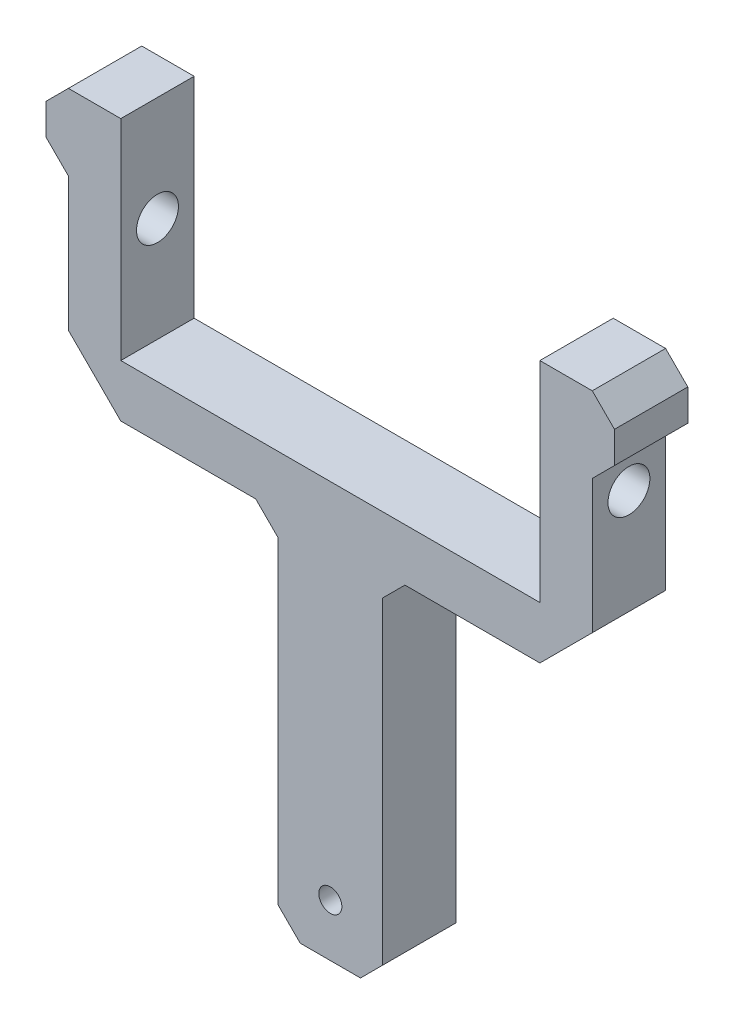
ISO-10303-21;
HEADER;
FILE_DESCRIPTION(('STEP AP214'),'2;1');
FILE_NAME('part.step','',(''),(''),'','','');
FILE_SCHEMA(('AUTOMOTIVE_DESIGN { 1 0 10303 214 1 1 1 1 }'));
ENDSEC;
DATA;
#1=APPLICATION_CONTEXT('core data for automotive mechanical design processes');
#2=APPLICATION_PROTOCOL_DEFINITION('international standard','automotive_design',2000,#1);
#3=PRODUCT_CONTEXT('',#1,'mechanical');
#4=PRODUCT('Part','Part','',(#3));
#5=PRODUCT_RELATED_PRODUCT_CATEGORY('part','',(#4));
#6=PRODUCT_DEFINITION_FORMATION('','',#4);
#7=PRODUCT_DEFINITION_CONTEXT('part definition',#1,'design');
#8=PRODUCT_DEFINITION('design','',#6,#7);
#9=PRODUCT_DEFINITION_SHAPE('','',#8);
#10=(LENGTH_UNIT() NAMED_UNIT(*) SI_UNIT(.MILLI.,.METRE.));
#11=(NAMED_UNIT(*) PLANE_ANGLE_UNIT() SI_UNIT($,.RADIAN.));
#12=(NAMED_UNIT(*) SI_UNIT($,.STERADIAN.) SOLID_ANGLE_UNIT());
#13=UNCERTAINTY_MEASURE_WITH_UNIT(LENGTH_MEASURE(1.E-05),#10,'distance_accuracy_value','');
#14=(GEOMETRIC_REPRESENTATION_CONTEXT(3) GLOBAL_UNCERTAINTY_ASSIGNED_CONTEXT((#13)) GLOBAL_UNIT_ASSIGNED_CONTEXT((#10,
#11,#12)) REPRESENTATION_CONTEXT('',''));
#15=CARTESIAN_POINT('',(0.,0.,0.));
#16=DIRECTION('',(0.,0.,1.));
#17=DIRECTION('',(1.,0.,0.));
#18=AXIS2_PLACEMENT_3D('',#15,#16,#17);
#19=CARTESIAN_POINT('',(-11.1786796564404,11.1786796564405,7.));
#20=DIRECTION('',(0.707106781186545,-0.70710678118655,0.));
#21=DIRECTION('',(0.70710678118655,0.707106781186545,0.));
#22=AXIS2_PLACEMENT_3D('',#19,#20,#21);
#23=PLANE('',#22);
#24=DIRECTION('',(0.,0.,-1.));
#25=VECTOR('',#24,1.);
#26=CARTESIAN_POINT('',(25.,47.3573593128807,7.));
#27=LINE('',#26,#25);
#28=CARTESIAN_POINT('',(25.,47.3573593128807,7.));
#29=VERTEX_POINT('',#28);
#30=CARTESIAN_POINT('',(25.,47.3573593128807,6.0386807597648));
#31=VERTEX_POINT('',#30);
#32=EDGE_CURVE('E224',#29,#31,#27,.T.);
#33=ORIENTED_EDGE('',*,*,#32,.T.);
#34=CARTESIAN_POINT('',(22.24,44.5973593128807,3.5));
#35=DIRECTION('',(0.707106781186545,-0.70710678118655,0.));
#36=DIRECTION('',(-0.70710678118655,-0.707106781186545,0.));
#37=AXIS2_PLACEMENT_3D('',#34,#35,#36);
#38=ELLIPSE('',#37,5.30330085889913,3.75);
#39=CARTESIAN_POINT('',(25.,47.3573593128807,0.961319240235201));
#40=VERTEX_POINT('',#39);
#41=EDGE_CURVE('E215',#31,#40,#38,.F.);
#42=ORIENTED_EDGE('',*,*,#41,.T.);
#43=CARTESIAN_POINT('',(25.,47.3573593128807,0.));
#44=VERTEX_POINT('',#43);
#45=EDGE_CURVE('E221',#40,#44,#27,.T.);
#46=ORIENTED_EDGE('',*,*,#45,.T.);
#47=DIRECTION('',(-0.70710678118655,-0.707106781186545,0.));
#48=VECTOR('',#47,1.);
#49=CARTESIAN_POINT('',(-11.1786796564404,11.1786796564405,0.));
#50=LINE('',#49,#48);
#51=CARTESIAN_POINT('',(27.1213203435596,49.4786796564403,0.));
#52=VERTEX_POINT('',#51);
#53=EDGE_CURVE('E279',#52,#44,#50,.T.);
#54=ORIENTED_EDGE('',*,*,#53,.F.);
#55=DIRECTION('',(0.,0.,-1.));
#56=VECTOR('',#55,1.);
#57=CARTESIAN_POINT('',(27.1213203435596,49.4786796564403,7.));
#58=LINE('',#57,#56);
#59=CARTESIAN_POINT('',(27.1213203435596,49.4786796564403,7.));
#60=VERTEX_POINT('',#59);
#61=EDGE_CURVE('E233',#60,#52,#58,.T.);
#62=ORIENTED_EDGE('',*,*,#61,.F.);
#63=DIRECTION('',(-0.70710678118655,-0.707106781186545,0.));
#64=VECTOR('',#63,1.);
#65=CARTESIAN_POINT('',(-11.1786796564404,11.1786796564405,7.));
#66=LINE('',#65,#64);
#67=EDGE_CURVE('E416',#60,#29,#66,.T.);
#68=ORIENTED_EDGE('',*,*,#67,.T.);
#69=EDGE_LOOP('',(#33,#42,#46,#54,#62,#68));
#70=FACE_BOUND('',#69,.T.);
#71=ADVANCED_FACE('F41',(#70),#23,.T.);
#72=CARTESIAN_POINT('',(11.1786796564404,11.1786796564405,7.));
#73=DIRECTION('',(0.707106781186545,0.70710678118655,0.));
#74=DIRECTION('',(-0.70710678118655,0.707106781186545,0.));
#75=AXIS2_PLACEMENT_3D('',#72,#73,#74);
#76=PLANE('',#75);
#77=CARTESIAN_POINT('',(-22.24,44.5973593128807,3.5));
#78=DIRECTION('',(0.707106781186545,0.70710678118655,0.));
#79=DIRECTION('',(0.70710678118655,-0.707106781186545,0.));
#80=AXIS2_PLACEMENT_3D('',#77,#78,#79);
#81=ELLIPSE('',#80,5.30330085889913,3.75);
#82=CARTESIAN_POINT('',(-25.,47.3573593128807,6.03868075976481));
#83=VERTEX_POINT('',#82);
#84=CARTESIAN_POINT('',(-25.,47.3573593128807,0.961319240235193));
#85=VERTEX_POINT('',#84);
#86=EDGE_CURVE('E872',#83,#85,#81,.F.);
#87=ORIENTED_EDGE('',*,*,#86,.F.);
#88=DIRECTION('',(0.,0.,-1.));
#89=VECTOR('',#88,1.);
#90=CARTESIAN_POINT('',(-25.,47.3573593128807,7.));
#91=LINE('',#90,#89);
#92=CARTESIAN_POINT('',(-25.,47.3573593128807,7.));
#93=VERTEX_POINT('',#92);
#94=EDGE_CURVE('E355',#93,#83,#91,.T.);
#95=ORIENTED_EDGE('',*,*,#94,.F.);
#96=DIRECTION('',(0.70710678118655,-0.707106781186545,0.));
#97=VECTOR('',#96,1.);
#98=CARTESIAN_POINT('',(11.1786796564404,11.1786796564405,7.));
#99=LINE('',#98,#97);
#100=CARTESIAN_POINT('',(-27.1213203435596,49.4786796564403,7.));
#101=VERTEX_POINT('',#100);
#102=EDGE_CURVE('E439',#101,#93,#99,.T.);
#103=ORIENTED_EDGE('',*,*,#102,.F.);
#104=DIRECTION('',(0.,0.,-1.));
#105=VECTOR('',#104,1.);
#106=CARTESIAN_POINT('',(-27.1213203435596,49.4786796564403,7.));
#107=LINE('',#106,#105);
#108=CARTESIAN_POINT('',(-27.1213203435596,49.4786796564403,0.));
#109=VERTEX_POINT('',#108);
#110=EDGE_CURVE('E358',#101,#109,#107,.T.);
#111=ORIENTED_EDGE('',*,*,#110,.T.);
#112=DIRECTION('',(0.70710678118655,-0.707106781186545,0.));
#113=VECTOR('',#112,1.);
#114=CARTESIAN_POINT('',(11.1786796564404,11.1786796564405,0.));
#115=LINE('',#114,#113);
#116=CARTESIAN_POINT('',(-25.,47.3573593128807,0.));
#117=VERTEX_POINT('',#116);
#118=EDGE_CURVE('E315',#109,#117,#115,.T.);
#119=ORIENTED_EDGE('',*,*,#118,.T.);
#120=EDGE_CURVE('E354',#85,#117,#91,.T.);
#121=ORIENTED_EDGE('',*,*,#120,.F.);
#122=EDGE_LOOP('',(#87,#95,#103,#111,#119,#121));
#123=FACE_BOUND('',#122,.T.);
#124=ADVANCED_FACE('F506',(#123),#76,.F.);
#125=CARTESIAN_POINT('',(-5.,0.,7.));
#126=DIRECTION('',(-1.,0.,0.));
#127=DIRECTION('',(0.,0.,1.));
#128=AXIS2_PLACEMENT_3D('',#125,#126,#127);
#129=PLANE('',#128);
#130=DIRECTION('',(0.,0.,-1.));
#131=VECTOR('',#130,1.);
#132=CARTESIAN_POINT('',(-5.,-2.87867965644036,7.));
#133=LINE('',#132,#131);
#134=CARTESIAN_POINT('',(-5.,-2.87867965644036,7.));
#135=VERTEX_POINT('',#134);
#136=CARTESIAN_POINT('',(-5.,-2.87867965644036,0.));
#137=VERTEX_POINT('',#136);
#138=EDGE_CURVE('E817',#135,#137,#133,.T.);
#139=ORIENTED_EDGE('',*,*,#138,.F.);
#140=DIRECTION('',(0.,1.,0.));
#141=VECTOR('',#140,1.);
#142=CARTESIAN_POINT('',(-5.,0.,7.));
#143=LINE('',#142,#141);
#144=CARTESIAN_POINT('',(-5.,27.4786796564403,7.));
#145=VERTEX_POINT('',#144);
#146=EDGE_CURVE('E338',#135,#145,#143,.T.);
#147=ORIENTED_EDGE('',*,*,#146,.T.);
#148=DIRECTION('',(0.,0.,-1.));
#149=VECTOR('',#148,1.);
#150=CARTESIAN_POINT('',(-5.,27.4786796564403,7.));
#151=LINE('',#150,#149);
#152=CARTESIAN_POINT('',(-5.,27.4786796564403,0.));
#153=VERTEX_POINT('',#152);
#154=EDGE_CURVE('E339',#145,#153,#151,.T.);
#155=ORIENTED_EDGE('',*,*,#154,.T.);
#156=DIRECTION('',(0.,1.,0.));
#157=VECTOR('',#156,1.);
#158=CARTESIAN_POINT('',(-5.,0.,0.));
#159=LINE('',#158,#157);
#160=EDGE_CURVE('E459',#137,#153,#159,.T.);
#161=ORIENTED_EDGE('',*,*,#160,.F.);
#162=EDGE_LOOP('',(#139,#147,#155,#161));
#163=FACE_BOUND('',#162,.T.);
#164=ADVANCED_FACE('F43',(#163),#129,.T.);
#165=CARTESIAN_POINT('',(0.,-5.,7.));
#166=DIRECTION('',(0.,1.,0.));
#167=DIRECTION('',(0.,0.,1.));
#168=AXIS2_PLACEMENT_3D('',#165,#166,#167);
#169=PLANE('',#168);
#170=DIRECTION('',(1.,0.,0.));
#171=VECTOR('',#170,1.);
#172=CARTESIAN_POINT('',(0.,-5.,0.));
#173=LINE('',#172,#171);
#174=CARTESIAN_POINT('',(-2.87867965644035,-4.99999999999999,0.));
#175=VERTEX_POINT('',#174);
#176=CARTESIAN_POINT('',(2.87867965644035,-5.,0.));
#177=VERTEX_POINT('',#176);
#178=EDGE_CURVE('E462',#175,#177,#173,.T.);
#179=ORIENTED_EDGE('',*,*,#178,.T.);
#180=DIRECTION('',(0.,0.,-1.));
#181=VECTOR('',#180,1.);
#182=CARTESIAN_POINT('',(2.87867965644035,-5.,7.));
#183=LINE('',#182,#181);
#184=CARTESIAN_POINT('',(2.87867965644035,-5.,7.));
#185=VERTEX_POINT('',#184);
#186=EDGE_CURVE('E804',#185,#177,#183,.T.);
#187=ORIENTED_EDGE('',*,*,#186,.F.);
#188=DIRECTION('',(1.,0.,0.));
#189=VECTOR('',#188,1.);
#190=CARTESIAN_POINT('',(0.,-5.,7.));
#191=LINE('',#190,#189);
#192=CARTESIAN_POINT('',(-2.87867965644035,-4.99999999999999,7.));
#193=VERTEX_POINT('',#192);
#194=EDGE_CURVE('E482',#193,#185,#191,.T.);
#195=ORIENTED_EDGE('',*,*,#194,.F.);
#196=DIRECTION('',(0.,0.,-1.));
#197=VECTOR('',#196,1.);
#198=CARTESIAN_POINT('',(-2.87867965644035,-4.99999999999999,7.));
#199=LINE('',#198,#197);
#200=EDGE_CURVE('E806',#193,#175,#199,.T.);
#201=ORIENTED_EDGE('',*,*,#200,.T.);
#202=EDGE_LOOP('',(#179,#187,#195,#201));
#203=FACE_BOUND('',#202,.T.);
#204=ADVANCED_FACE('F736',(#203),#169,.F.);
#205=CARTESIAN_POINT('',(5.,0.,7.));
#206=DIRECTION('',(-1.,0.,0.));
#207=DIRECTION('',(0.,0.,1.));
#208=AXIS2_PLACEMENT_3D('',#205,#206,#207);
#209=PLANE('',#208);
#210=DIRECTION('',(0.,1.,0.));
#211=VECTOR('',#210,1.);
#212=CARTESIAN_POINT('',(5.,0.,7.));
#213=LINE('',#212,#211);
#214=CARTESIAN_POINT('',(5.,-2.87867965644037,7.));
#215=VERTEX_POINT('',#214);
#216=CARTESIAN_POINT('',(5.,27.4786796564403,7.));
#217=VERTEX_POINT('',#216);
#218=EDGE_CURVE('E476',#215,#217,#213,.T.);
#219=ORIENTED_EDGE('',*,*,#218,.F.);
#220=DIRECTION('',(0.,0.,-1.));
#221=VECTOR('',#220,1.);
#222=CARTESIAN_POINT('',(5.,-2.87867965644037,7.));
#223=LINE('',#222,#221);
#224=CARTESIAN_POINT('',(5.,-2.87867965644037,0.));
#225=VERTEX_POINT('',#224);
#226=EDGE_CURVE('E463',#215,#225,#223,.T.);
#227=ORIENTED_EDGE('',*,*,#226,.T.);
#228=DIRECTION('',(0.,1.,0.));
#229=VECTOR('',#228,1.);
#230=CARTESIAN_POINT('',(5.,0.,0.));
#231=LINE('',#230,#229);
#232=CARTESIAN_POINT('',(5.,27.4786796564403,0.));
#233=VERTEX_POINT('',#232);
#234=EDGE_CURVE('E273',#225,#233,#231,.T.);
#235=ORIENTED_EDGE('',*,*,#234,.T.);
#236=DIRECTION('',(0.,0.,-1.));
#237=VECTOR('',#236,1.);
#238=CARTESIAN_POINT('',(5.,27.4786796564403,7.));
#239=LINE('',#238,#237);
#240=EDGE_CURVE('E11',#217,#233,#239,.T.);
#241=ORIENTED_EDGE('',*,*,#240,.F.);
#242=EDGE_LOOP('',(#219,#227,#235,#241));
#243=FACE_BOUND('',#242,.T.);
#244=ADVANCED_FACE('F471',(#243),#209,.F.);
#245=CARTESIAN_POINT('',(-11.2393398282202,11.2393398282202,7.));
#246=DIRECTION('',(-0.707106781186547,0.707106781186549,0.));
#247=DIRECTION('',(-0.707106781186549,-0.707106781186546,0.));
#248=AXIS2_PLACEMENT_3D('',#245,#246,#247);
#249=PLANE('',#248);
#250=DIRECTION('',(0.707106781186549,0.707106781186546,0.));
#251=VECTOR('',#250,1.);
#252=CARTESIAN_POINT('',(-11.2393398282202,11.2393398282202,0.));
#253=LINE('',#252,#251);
#254=CARTESIAN_POINT('',(7.12132034355965,29.6,0.));
#255=VERTEX_POINT('',#254);
#256=EDGE_CURVE('E265',#233,#255,#253,.T.);
#257=ORIENTED_EDGE('',*,*,#256,.T.);
#258=DIRECTION('',(0.,0.,-1.));
#259=VECTOR('',#258,1.);
#260=CARTESIAN_POINT('',(7.12132034355965,29.6,7.));
#261=LINE('',#260,#259);
#262=CARTESIAN_POINT('',(7.12132034355965,29.6,7.));
#263=VERTEX_POINT('',#262);
#264=EDGE_CURVE('E50',#263,#255,#261,.T.);
#265=ORIENTED_EDGE('',*,*,#264,.F.);
#266=DIRECTION('',(0.707106781186549,0.707106781186546,0.));
#267=VECTOR('',#266,1.);
#268=CARTESIAN_POINT('',(-11.2393398282202,11.2393398282202,7.));
#269=LINE('',#268,#267);
#270=EDGE_CURVE('E474',#217,#263,#269,.T.);
#271=ORIENTED_EDGE('',*,*,#270,.F.);
#272=ORIENTED_EDGE('',*,*,#240,.T.);
#273=EDGE_LOOP('',(#257,#265,#271,#272));
#274=FACE_BOUND('',#273,.T.);
#275=ADVANCED_FACE('F473',(#274),#249,.F.);
#276=CARTESIAN_POINT('',(0.,29.6,7.));
#277=DIRECTION('',(0.,1.,0.));
#278=DIRECTION('',(-1.,0.,0.));
#279=AXIS2_PLACEMENT_3D('',#276,#277,#278);
#280=PLANE('',#279);
#281=DIRECTION('',(1.,0.,0.));
#282=VECTOR('',#281,1.);
#283=CARTESIAN_POINT('',(0.,29.6,0.));
#284=LINE('',#283,#282);
#285=CARTESIAN_POINT('',(20.0026406871193,29.6,0.));
#286=VERTEX_POINT('',#285);
#287=EDGE_CURVE('E255',#255,#286,#284,.T.);
#288=ORIENTED_EDGE('',*,*,#287,.T.);
#289=DIRECTION('',(0.,0.,-1.));
#290=VECTOR('',#289,1.);
#291=CARTESIAN_POINT('',(20.0026406871193,29.6,7.));
#292=LINE('',#291,#290);
#293=CARTESIAN_POINT('',(20.0026406871193,29.6,7.));
#294=VERTEX_POINT('',#293);
#295=EDGE_CURVE('E244',#294,#286,#292,.T.);
#296=ORIENTED_EDGE('',*,*,#295,.F.);
#297=DIRECTION('',(1.,0.,0.));
#298=VECTOR('',#297,1.);
#299=CARTESIAN_POINT('',(0.,29.6,7.));
#300=LINE('',#299,#298);
#301=EDGE_CURVE('E257',#263,#294,#300,.T.);
#302=ORIENTED_EDGE('',*,*,#301,.F.);
#303=ORIENTED_EDGE('',*,*,#264,.T.);
#304=EDGE_LOOP('',(#288,#296,#302,#303));
#305=FACE_BOUND('',#304,.T.);
#306=ADVANCED_FACE('F253',(#305),#280,.F.);
#307=CARTESIAN_POINT('',(-4.79867965644035,4.79867965644035,7.));
#308=DIRECTION('',(0.707106781186547,-0.707106781186547,0.));
#309=DIRECTION('',(0.707106781186548,0.707106781186548,0.));
#310=AXIS2_PLACEMENT_3D('',#307,#308,#309);
#311=PLANE('',#310);
#312=DIRECTION('',(-0.707106781186548,-0.707106781186548,0.));
#313=VECTOR('',#312,1.);
#314=CARTESIAN_POINT('',(-4.79867965644035,4.79867965644035,0.));
#315=LINE('',#314,#313);
#316=CARTESIAN_POINT('',(25.,34.5973593128807,0.));
#317=VERTEX_POINT('',#316);
#318=EDGE_CURVE('E267',#317,#286,#315,.T.);
#319=ORIENTED_EDGE('',*,*,#318,.F.);
#320=DIRECTION('',(0.,0.,-1.));
#321=VECTOR('',#320,1.);
#322=CARTESIAN_POINT('',(25.,34.5973593128807,7.));
#323=LINE('',#322,#321);
#324=CARTESIAN_POINT('',(25.,34.5973593128807,7.));
#325=VERTEX_POINT('',#324);
#326=EDGE_CURVE('E237',#325,#317,#323,.T.);
#327=ORIENTED_EDGE('',*,*,#326,.F.);
#328=DIRECTION('',(-0.707106781186548,-0.707106781186548,0.));
#329=VECTOR('',#328,1.);
#330=CARTESIAN_POINT('',(-4.79867965644035,4.79867965644035,7.));
#331=LINE('',#330,#329);
#332=EDGE_CURVE('E480',#325,#294,#331,.T.);
#333=ORIENTED_EDGE('',*,*,#332,.T.);
#334=ORIENTED_EDGE('',*,*,#295,.T.);
#335=EDGE_LOOP('',(#319,#327,#333,#334));
#336=FACE_BOUND('',#335,.T.);
#337=ADVANCED_FACE('F496',(#336),#311,.T.);
#338=CARTESIAN_POINT('',(25.,0.,7.));
#339=DIRECTION('',(1.,0.,0.));
#340=DIRECTION('',(0.,1.,0.));
#341=AXIS2_PLACEMENT_3D('',#338,#339,#340);
#342=PLANE('',#341);
#343=DIRECTION('',(0.,-1.,0.));
#344=VECTOR('',#343,1.);
#345=CARTESIAN_POINT('',(25.,0.,7.));
#346=LINE('',#345,#344);
#347=EDGE_CURVE('E489',#29,#325,#346,.T.);
#348=ORIENTED_EDGE('',*,*,#347,.T.);
#349=ORIENTED_EDGE('',*,*,#326,.T.);
#350=DIRECTION('',(0.,-1.,0.));
#351=VECTOR('',#350,1.);
#352=CARTESIAN_POINT('',(25.,0.,0.));
#353=LINE('',#352,#351);
#354=EDGE_CURVE('E230',#44,#317,#353,.T.);
#355=ORIENTED_EDGE('',*,*,#354,.F.);
#356=ORIENTED_EDGE('',*,*,#45,.F.);
#357=CARTESIAN_POINT('',(25.,44.5973593128807,3.5));
#358=DIRECTION('',(1.,0.,0.));
#359=DIRECTION('',(0.,1.,0.));
#360=AXIS2_PLACEMENT_3D('',#357,#358,#359);
#361=CIRCLE('',#360,3.75);
#362=EDGE_CURVE('E57',#40,#31,#361,.T.);
#363=ORIENTED_EDGE('',*,*,#362,.T.);
#364=ORIENTED_EDGE('',*,*,#32,.F.);
#365=EDGE_LOOP('',(#348,#349,#355,#356,#363,#364));
#366=FACE_BOUND('',#365,.T.);
#367=CARTESIAN_POINT('',(25.,44.5973593128807,3.5));
#368=DIRECTION('',(1.,0.,0.));
#369=DIRECTION('',(0.,1.,0.));
#370=AXIS2_PLACEMENT_3D('',#367,#368,#369);
#371=CIRCLE('',#370,2.);
#372=CARTESIAN_POINT('',(25.,46.5973593128807,3.5));
#373=VERTEX_POINT('',#372);
#374=EDGE_CURVE('E830',#373,#373,#371,.T.);
#375=ORIENTED_EDGE('',*,*,#374,.F.);
#376=EDGE_LOOP('',(#375));
#377=FACE_BOUND('',#376,.T.);
#378=ADVANCED_FACE('F227',(#366,#377),#342,.T.);
#379=CARTESIAN_POINT('',(27.1213203435596,0.,7.));
#380=DIRECTION('',(1.,0.,0.));
#381=DIRECTION('',(0.,0.,-1.));
#382=AXIS2_PLACEMENT_3D('',#379,#380,#381);
#383=PLANE('',#382);
#384=DIRECTION('',(0.,-1.,0.));
#385=VECTOR('',#384,1.);
#386=CARTESIAN_POINT('',(27.1213203435596,0.,0.));
#387=LINE('',#386,#385);
#388=CARTESIAN_POINT('',(27.1213203435596,52.4786796564403,0.));
#389=VERTEX_POINT('',#388);
#390=EDGE_CURVE('E282',#389,#52,#387,.T.);
#391=ORIENTED_EDGE('',*,*,#390,.F.);
#392=DIRECTION('',(0.,0.,-1.));
#393=VECTOR('',#392,1.);
#394=CARTESIAN_POINT('',(27.1213203435596,52.4786796564403,7.));
#395=LINE('',#394,#393);
#396=CARTESIAN_POINT('',(27.1213203435596,52.4786796564403,7.));
#397=VERTEX_POINT('',#396);
#398=EDGE_CURVE('E238',#397,#389,#395,.T.);
#399=ORIENTED_EDGE('',*,*,#398,.F.);
#400=DIRECTION('',(0.,-1.,0.));
#401=VECTOR('',#400,1.);
#402=CARTESIAN_POINT('',(27.1213203435596,0.,7.));
#403=LINE('',#402,#401);
#404=EDGE_CURVE('E409',#397,#60,#403,.T.);
#405=ORIENTED_EDGE('',*,*,#404,.T.);
#406=ORIENTED_EDGE('',*,*,#61,.T.);
#407=EDGE_LOOP('',(#391,#399,#405,#406));
#408=FACE_BOUND('',#407,.T.);
#409=ADVANCED_FACE('F395',(#408),#383,.T.);
#410=CARTESIAN_POINT('',(39.8,39.8,7.));
#411=DIRECTION('',(0.707106781186547,0.707106781186547,0.));
#412=DIRECTION('',(-0.707106781186548,0.707106781186548,0.));
#413=AXIS2_PLACEMENT_3D('',#410,#411,#412);
#414=PLANE('',#413);
#415=DIRECTION('',(0.707106781186548,-0.707106781186548,0.));
#416=VECTOR('',#415,1.);
#417=CARTESIAN_POINT('',(39.8,39.8,0.));
#418=LINE('',#417,#416);
#419=CARTESIAN_POINT('',(25.,54.6,0.));
#420=VERTEX_POINT('',#419);
#421=EDGE_CURVE('E286',#420,#389,#418,.T.);
#422=ORIENTED_EDGE('',*,*,#421,.F.);
#423=DIRECTION('',(0.,0.,-1.));
#424=VECTOR('',#423,1.);
#425=CARTESIAN_POINT('',(25.,54.6,7.));
#426=LINE('',#425,#424);
#427=CARTESIAN_POINT('',(25.,54.6,7.));
#428=VERTEX_POINT('',#427);
#429=EDGE_CURVE('E382',#428,#420,#426,.T.);
#430=ORIENTED_EDGE('',*,*,#429,.F.);
#431=DIRECTION('',(0.707106781186548,-0.707106781186548,0.));
#432=VECTOR('',#431,1.);
#433=CARTESIAN_POINT('',(39.8,39.8,7.));
#434=LINE('',#433,#432);
#435=EDGE_CURVE('E391',#428,#397,#434,.T.);
#436=ORIENTED_EDGE('',*,*,#435,.T.);
#437=ORIENTED_EDGE('',*,*,#398,.T.);
#438=EDGE_LOOP('',(#422,#430,#436,#437));
#439=FACE_BOUND('',#438,.T.);
#440=ADVANCED_FACE('F389',(#439),#414,.T.);
#441=CARTESIAN_POINT('',(0.,54.6,7.));
#442=DIRECTION('',(0.,1.,0.));
#443=DIRECTION('',(0.,0.,1.));
#444=AXIS2_PLACEMENT_3D('',#441,#442,#443);
#445=PLANE('',#444);
#446=DIRECTION('',(1.,0.,0.));
#447=VECTOR('',#446,1.);
#448=CARTESIAN_POINT('',(0.,54.6,0.));
#449=LINE('',#448,#447);
#450=CARTESIAN_POINT('',(20.,54.6,0.));
#451=VERTEX_POINT('',#450);
#452=EDGE_CURVE('E290',#451,#420,#449,.T.);
#453=ORIENTED_EDGE('',*,*,#452,.F.);
#454=DIRECTION('',(0.,0.,-1.));
#455=VECTOR('',#454,1.);
#456=CARTESIAN_POINT('',(20.,54.6,7.));
#457=LINE('',#456,#455);
#458=CARTESIAN_POINT('',(20.,54.6,7.));
#459=VERTEX_POINT('',#458);
#460=EDGE_CURVE('E379',#459,#451,#457,.T.);
#461=ORIENTED_EDGE('',*,*,#460,.F.);
#462=DIRECTION('',(1.,0.,0.));
#463=VECTOR('',#462,1.);
#464=CARTESIAN_POINT('',(0.,54.6,7.));
#465=LINE('',#464,#463);
#466=EDGE_CURVE('E403',#459,#428,#465,.T.);
#467=ORIENTED_EDGE('',*,*,#466,.T.);
#468=ORIENTED_EDGE('',*,*,#429,.T.);
#469=EDGE_LOOP('',(#453,#461,#467,#468));
#470=FACE_BOUND('',#469,.T.);
#471=ADVANCED_FACE('F399',(#470),#445,.T.);
#472=CARTESIAN_POINT('',(20.,0.,7.));
#473=DIRECTION('',(1.,0.,0.));
#474=DIRECTION('',(0.,0.,-1.));
#475=AXIS2_PLACEMENT_3D('',#472,#473,#474);
#476=PLANE('',#475);
#477=CARTESIAN_POINT('',(20.,44.5973593128807,3.5));
#478=DIRECTION('',(1.,0.,0.));
#479=DIRECTION('',(0.,0.,-1.));
#480=AXIS2_PLACEMENT_3D('',#477,#478,#479);
#481=CIRCLE('',#480,2.);
#482=CARTESIAN_POINT('',(20.,44.5973593128807,1.5));
#483=VERTEX_POINT('',#482);
#484=EDGE_CURVE('E886',#483,#483,#481,.T.);
#485=ORIENTED_EDGE('',*,*,#484,.T.);
#486=EDGE_LOOP('',(#485));
#487=FACE_BOUND('',#486,.T.);
#488=DIRECTION('',(0.,-1.,0.));
#489=VECTOR('',#488,1.);
#490=CARTESIAN_POINT('',(20.,0.,0.));
#491=LINE('',#490,#489);
#492=CARTESIAN_POINT('',(20.,34.6,0.));
#493=VERTEX_POINT('',#492);
#494=EDGE_CURVE('E294',#451,#493,#491,.T.);
#495=ORIENTED_EDGE('',*,*,#494,.T.);
#496=DIRECTION('',(0.,0.,-1.));
#497=VECTOR('',#496,1.);
#498=CARTESIAN_POINT('',(20.,34.6,7.));
#499=LINE('',#498,#497);
#500=CARTESIAN_POINT('',(20.,34.6,7.));
#501=VERTEX_POINT('',#500);
#502=EDGE_CURVE('E376',#501,#493,#499,.T.);
#503=ORIENTED_EDGE('',*,*,#502,.F.);
#504=DIRECTION('',(0.,-1.,0.));
#505=VECTOR('',#504,1.);
#506=CARTESIAN_POINT('',(20.,0.,7.));
#507=LINE('',#506,#505);
#508=EDGE_CURVE('E414',#459,#501,#507,.T.);
#509=ORIENTED_EDGE('',*,*,#508,.F.);
#510=ORIENTED_EDGE('',*,*,#460,.T.);
#511=EDGE_LOOP('',(#495,#503,#509,#510));
#512=FACE_BOUND('',#511,.T.);
#513=ADVANCED_FACE('F520',(#487,#512),#476,.F.);
#514=CARTESIAN_POINT('',(0.,34.6,7.));
#515=DIRECTION('',(0.,1.,0.));
#516=DIRECTION('',(0.,0.,1.));
#517=AXIS2_PLACEMENT_3D('',#514,#515,#516);
#518=PLANE('',#517);
#519=DIRECTION('',(1.,0.,0.));
#520=VECTOR('',#519,1.);
#521=CARTESIAN_POINT('',(0.,34.6,0.));
#522=LINE('',#521,#520);
#523=CARTESIAN_POINT('',(-20.,34.6,0.));
#524=VERTEX_POINT('',#523);
#525=EDGE_CURVE('E298',#524,#493,#522,.T.);
#526=ORIENTED_EDGE('',*,*,#525,.F.);
#527=DIRECTION('',(0.,0.,-1.));
#528=VECTOR('',#527,1.);
#529=CARTESIAN_POINT('',(-20.,34.6,7.));
#530=LINE('',#529,#528);
#531=CARTESIAN_POINT('',(-20.,34.6,7.));
#532=VERTEX_POINT('',#531);
#533=EDGE_CURVE('E373',#532,#524,#530,.T.);
#534=ORIENTED_EDGE('',*,*,#533,.F.);
#535=DIRECTION('',(1.,0.,0.));
#536=VECTOR('',#535,1.);
#537=CARTESIAN_POINT('',(0.,34.6,7.));
#538=LINE('',#537,#536);
#539=EDGE_CURVE('E422',#532,#501,#538,.T.);
#540=ORIENTED_EDGE('',*,*,#539,.T.);
#541=ORIENTED_EDGE('',*,*,#502,.T.);
#542=EDGE_LOOP('',(#526,#534,#540,#541));
#543=FACE_BOUND('',#542,.T.);
#544=ADVANCED_FACE('F523',(#543),#518,.T.);
#545=CARTESIAN_POINT('',(-20.,0.,7.));
#546=DIRECTION('',(1.,0.,0.));
#547=DIRECTION('',(0.,0.,-1.));
#548=AXIS2_PLACEMENT_3D('',#545,#546,#547);
#549=PLANE('',#548);
#550=CARTESIAN_POINT('',(-20.,44.5973593128807,3.5));
#551=DIRECTION('',(1.,0.,0.));
#552=DIRECTION('',(0.,0.,-1.));
#553=AXIS2_PLACEMENT_3D('',#550,#551,#552);
#554=CIRCLE('',#553,2.);
#555=CARTESIAN_POINT('',(-20.,44.5973593128807,1.5));
#556=VERTEX_POINT('',#555);
#557=EDGE_CURVE('E879',#556,#556,#554,.T.);
#558=ORIENTED_EDGE('',*,*,#557,.F.);
#559=EDGE_LOOP('',(#558));
#560=FACE_BOUND('',#559,.T.);
#561=DIRECTION('',(0.,-1.,0.));
#562=VECTOR('',#561,1.);
#563=CARTESIAN_POINT('',(-20.,0.,0.));
#564=LINE('',#563,#562);
#565=CARTESIAN_POINT('',(-20.,54.6,0.));
#566=VERTEX_POINT('',#565);
#567=EDGE_CURVE('E302',#566,#524,#564,.T.);
#568=ORIENTED_EDGE('',*,*,#567,.F.);
#569=DIRECTION('',(0.,0.,-1.));
#570=VECTOR('',#569,1.);
#571=CARTESIAN_POINT('',(-20.,54.6,7.));
#572=LINE('',#571,#570);
#573=CARTESIAN_POINT('',(-20.,54.6,7.));
#574=VERTEX_POINT('',#573);
#575=EDGE_CURVE('E370',#574,#566,#572,.T.);
#576=ORIENTED_EDGE('',*,*,#575,.F.);
#577=DIRECTION('',(0.,-1.,0.));
#578=VECTOR('',#577,1.);
#579=CARTESIAN_POINT('',(-20.,0.,7.));
#580=LINE('',#579,#578);
#581=EDGE_CURVE('E426',#574,#532,#580,.T.);
#582=ORIENTED_EDGE('',*,*,#581,.T.);
#583=ORIENTED_EDGE('',*,*,#533,.T.);
#584=EDGE_LOOP('',(#568,#576,#582,#583));
#585=FACE_BOUND('',#584,.T.);
#586=ADVANCED_FACE('F527',(#560,#585),#549,.T.);
#587=CARTESIAN_POINT('',(0.,54.6,7.));
#588=DIRECTION('',(0.,-1.,0.));
#589=DIRECTION('',(0.,0.,-1.));
#590=AXIS2_PLACEMENT_3D('',#587,#588,#589);
#591=PLANE('',#590);
#592=DIRECTION('',(-1.,0.,0.));
#593=VECTOR('',#592,1.);
#594=CARTESIAN_POINT('',(0.,54.6,0.));
#595=LINE('',#594,#593);
#596=CARTESIAN_POINT('',(-25.,54.6,0.));
#597=VERTEX_POINT('',#596);
#598=EDGE_CURVE('E306',#566,#597,#595,.T.);
#599=ORIENTED_EDGE('',*,*,#598,.T.);
#600=DIRECTION('',(0.,0.,-1.));
#601=VECTOR('',#600,1.);
#602=CARTESIAN_POINT('',(-25.,54.6,7.));
#603=LINE('',#602,#601);
#604=CARTESIAN_POINT('',(-25.,54.6,7.));
#605=VERTEX_POINT('',#604);
#606=EDGE_CURVE('E366',#605,#597,#603,.T.);
#607=ORIENTED_EDGE('',*,*,#606,.F.);
#608=DIRECTION('',(-1.,0.,0.));
#609=VECTOR('',#608,1.);
#610=CARTESIAN_POINT('',(0.,54.6,7.));
#611=LINE('',#610,#609);
#612=EDGE_CURVE('E430',#574,#605,#611,.T.);
#613=ORIENTED_EDGE('',*,*,#612,.F.);
#614=ORIENTED_EDGE('',*,*,#575,.T.);
#615=EDGE_LOOP('',(#599,#607,#613,#614));
#616=FACE_BOUND('',#615,.T.);
#617=ADVANCED_FACE('F531',(#616),#591,.F.);
#618=CARTESIAN_POINT('',(-39.8,39.8,7.));
#619=DIRECTION('',(0.707106781186547,-0.707106781186547,0.));
#620=DIRECTION('',(0.707106781186548,0.707106781186548,0.));
#621=AXIS2_PLACEMENT_3D('',#618,#619,#620);
#622=PLANE('',#621);
#623=DIRECTION('',(-0.707106781186548,-0.707106781186548,0.));
#624=VECTOR('',#623,1.);
#625=CARTESIAN_POINT('',(-39.8,39.8,0.));
#626=LINE('',#625,#624);
#627=CARTESIAN_POINT('',(-27.1213203435596,52.4786796564403,0.));
#628=VERTEX_POINT('',#627);
#629=EDGE_CURVE('E309',#597,#628,#626,.T.);
#630=ORIENTED_EDGE('',*,*,#629,.T.);
#631=DIRECTION('',(0.,0.,-1.));
#632=VECTOR('',#631,1.);
#633=CARTESIAN_POINT('',(-27.1213203435596,52.4786796564403,7.));
#634=LINE('',#633,#632);
#635=CARTESIAN_POINT('',(-27.1213203435596,52.4786796564403,7.));
#636=VERTEX_POINT('',#635);
#637=EDGE_CURVE('E362',#636,#628,#634,.T.);
#638=ORIENTED_EDGE('',*,*,#637,.F.);
#639=DIRECTION('',(-0.707106781186548,-0.707106781186548,0.));
#640=VECTOR('',#639,1.);
#641=CARTESIAN_POINT('',(-39.8,39.8,7.));
#642=LINE('',#641,#640);
#643=EDGE_CURVE('E433',#605,#636,#642,.T.);
#644=ORIENTED_EDGE('',*,*,#643,.F.);
#645=ORIENTED_EDGE('',*,*,#606,.T.);
#646=EDGE_LOOP('',(#630,#638,#644,#645));
#647=FACE_BOUND('',#646,.T.);
#648=ADVANCED_FACE('F535',(#647),#622,.F.);
#649=CARTESIAN_POINT('',(-27.1213203435596,0.,7.));
#650=DIRECTION('',(1.,0.,0.));
#651=DIRECTION('',(0.,0.,-1.));
#652=AXIS2_PLACEMENT_3D('',#649,#650,#651);
#653=PLANE('',#652);
#654=DIRECTION('',(0.,-1.,0.));
#655=VECTOR('',#654,1.);
#656=CARTESIAN_POINT('',(-27.1213203435596,0.,0.));
#657=LINE('',#656,#655);
#658=EDGE_CURVE('E312',#628,#109,#657,.T.);
#659=ORIENTED_EDGE('',*,*,#658,.T.);
#660=ORIENTED_EDGE('',*,*,#110,.F.);
#661=DIRECTION('',(0.,-1.,0.));
#662=VECTOR('',#661,1.);
#663=CARTESIAN_POINT('',(-27.1213203435596,0.,7.));
#664=LINE('',#663,#662);
#665=EDGE_CURVE('E436',#636,#101,#664,.T.);
#666=ORIENTED_EDGE('',*,*,#665,.F.);
#667=ORIENTED_EDGE('',*,*,#637,.T.);
#668=EDGE_LOOP('',(#659,#660,#666,#667));
#669=FACE_BOUND('',#668,.T.);
#670=ADVANCED_FACE('F539',(#669),#653,.F.);
#671=CARTESIAN_POINT('',(-25.,0.,7.));
#672=DIRECTION('',(1.,0.,0.));
#673=DIRECTION('',(0.,1.,0.));
#674=AXIS2_PLACEMENT_3D('',#671,#672,#673);
#675=PLANE('',#674);
#676=ORIENTED_EDGE('',*,*,#94,.T.);
#677=CARTESIAN_POINT('',(-25.,44.5973593128807,3.5));
#678=DIRECTION('',(-1.,0.,0.));
#679=DIRECTION('',(0.,-1.,0.));
#680=AXIS2_PLACEMENT_3D('',#677,#678,#679);
#681=CIRCLE('',#680,3.75);
#682=EDGE_CURVE('E65',#83,#85,#681,.T.);
#683=ORIENTED_EDGE('',*,*,#682,.T.);
#684=ORIENTED_EDGE('',*,*,#120,.T.);
#685=DIRECTION('',(0.,-1.,0.));
#686=VECTOR('',#685,1.);
#687=CARTESIAN_POINT('',(-25.,0.,0.));
#688=LINE('',#687,#686);
#689=CARTESIAN_POINT('',(-25.,34.5973593128807,0.));
#690=VERTEX_POINT('',#689);
#691=EDGE_CURVE('E319',#117,#690,#688,.T.);
#692=ORIENTED_EDGE('',*,*,#691,.T.);
#693=DIRECTION('',(0.,0.,-1.));
#694=VECTOR('',#693,1.);
#695=CARTESIAN_POINT('',(-25.,34.5973593128807,7.));
#696=LINE('',#695,#694);
#697=CARTESIAN_POINT('',(-25.,34.5973593128807,7.));
#698=VERTEX_POINT('',#697);
#699=EDGE_CURVE('E350',#698,#690,#696,.T.);
#700=ORIENTED_EDGE('',*,*,#699,.F.);
#701=DIRECTION('',(0.,-1.,0.));
#702=VECTOR('',#701,1.);
#703=CARTESIAN_POINT('',(-25.,0.,7.));
#704=LINE('',#703,#702);
#705=EDGE_CURVE('E442',#93,#698,#704,.T.);
#706=ORIENTED_EDGE('',*,*,#705,.F.);
#707=EDGE_LOOP('',(#676,#683,#684,#692,#700,#706));
#708=FACE_BOUND('',#707,.T.);
#709=CARTESIAN_POINT('',(-25.,44.5973593128807,3.5));
#710=DIRECTION('',(-1.,0.,0.));
#711=DIRECTION('',(0.,-1.,0.));
#712=AXIS2_PLACEMENT_3D('',#709,#710,#711);
#713=CIRCLE('',#712,2.);
#714=CARTESIAN_POINT('',(-25.,42.5973593128807,3.5));
#715=VERTEX_POINT('',#714);
#716=EDGE_CURVE('E874',#715,#715,#713,.T.);
#717=ORIENTED_EDGE('',*,*,#716,.F.);
#718=EDGE_LOOP('',(#717));
#719=FACE_BOUND('',#718,.T.);
#720=ADVANCED_FACE('F542',(#708,#719),#675,.F.);
#721=CARTESIAN_POINT('',(4.79867965644035,4.79867965644035,7.));
#722=DIRECTION('',(0.707106781186547,0.707106781186547,0.));
#723=DIRECTION('',(-0.707106781186548,0.707106781186548,0.));
#724=AXIS2_PLACEMENT_3D('',#721,#722,#723);
#725=PLANE('',#724);
#726=DIRECTION('',(0.707106781186548,-0.707106781186548,0.));
#727=VECTOR('',#726,1.);
#728=CARTESIAN_POINT('',(4.79867965644035,4.79867965644035,0.));
#729=LINE('',#728,#727);
#730=CARTESIAN_POINT('',(-20.0026406871193,29.6,0.));
#731=VERTEX_POINT('',#730);
#732=EDGE_CURVE('E322',#690,#731,#729,.T.);
#733=ORIENTED_EDGE('',*,*,#732,.T.);
#734=DIRECTION('',(0.,0.,-1.));
#735=VECTOR('',#734,1.);
#736=CARTESIAN_POINT('',(-20.0026406871193,29.6,7.));
#737=LINE('',#736,#735);
#738=CARTESIAN_POINT('',(-20.0026406871193,29.6,7.));
#739=VERTEX_POINT('',#738);
#740=EDGE_CURVE('E347',#739,#731,#737,.T.);
#741=ORIENTED_EDGE('',*,*,#740,.F.);
#742=DIRECTION('',(0.707106781186548,-0.707106781186548,0.));
#743=VECTOR('',#742,1.);
#744=CARTESIAN_POINT('',(4.79867965644035,4.79867965644035,7.));
#745=LINE('',#744,#743);
#746=EDGE_CURVE('E445',#698,#739,#745,.T.);
#747=ORIENTED_EDGE('',*,*,#746,.F.);
#748=ORIENTED_EDGE('',*,*,#699,.T.);
#749=EDGE_LOOP('',(#733,#741,#747,#748));
#750=FACE_BOUND('',#749,.T.);
#751=ADVANCED_FACE('F547',(#750),#725,.F.);
#752=CARTESIAN_POINT('',(0.,29.6,7.));
#753=DIRECTION('',(0.,-1.,0.));
#754=DIRECTION('',(1.,0.,0.));
#755=AXIS2_PLACEMENT_3D('',#752,#753,#754);
#756=PLANE('',#755);
#757=DIRECTION('',(-1.,0.,0.));
#758=VECTOR('',#757,1.);
#759=CARTESIAN_POINT('',(0.,29.6,0.));
#760=LINE('',#759,#758);
#761=CARTESIAN_POINT('',(-7.12132034355964,29.6,0.));
#762=VERTEX_POINT('',#761);
#763=EDGE_CURVE('E326',#762,#731,#760,.T.);
#764=ORIENTED_EDGE('',*,*,#763,.F.);
#765=DIRECTION('',(0.,0.,-1.));
#766=VECTOR('',#765,1.);
#767=CARTESIAN_POINT('',(-7.12132034355964,29.6,7.));
#768=LINE('',#767,#766);
#769=CARTESIAN_POINT('',(-7.12132034355964,29.6,7.));
#770=VERTEX_POINT('',#769);
#771=EDGE_CURVE('E343',#770,#762,#768,.T.);
#772=ORIENTED_EDGE('',*,*,#771,.F.);
#773=DIRECTION('',(-1.,0.,0.));
#774=VECTOR('',#773,1.);
#775=CARTESIAN_POINT('',(0.,29.6,7.));
#776=LINE('',#775,#774);
#777=EDGE_CURVE('E448',#770,#739,#776,.T.);
#778=ORIENTED_EDGE('',*,*,#777,.T.);
#779=ORIENTED_EDGE('',*,*,#740,.T.);
#780=EDGE_LOOP('',(#764,#772,#778,#779));
#781=FACE_BOUND('',#780,.T.);
#782=ADVANCED_FACE('F550',(#781),#756,.T.);
#783=CARTESIAN_POINT('',(11.2393398282202,11.2393398282201,7.));
#784=DIRECTION('',(-0.707106781186548,-0.707106781186546,0.));
#785=DIRECTION('',(0.707106781186547,-0.707106781186549,0.));
#786=AXIS2_PLACEMENT_3D('',#783,#784,#785);
#787=PLANE('',#786);
#788=DIRECTION('',(-0.707106781186547,0.707106781186549,0.));
#789=VECTOR('',#788,1.);
#790=CARTESIAN_POINT('',(11.2393398282202,11.2393398282201,0.));
#791=LINE('',#790,#789);
#792=EDGE_CURVE('E330',#153,#762,#791,.T.);
#793=ORIENTED_EDGE('',*,*,#792,.F.);
#794=ORIENTED_EDGE('',*,*,#154,.F.);
#795=DIRECTION('',(-0.707106781186547,0.707106781186549,0.));
#796=VECTOR('',#795,1.);
#797=CARTESIAN_POINT('',(11.2393398282202,11.2393398282201,7.));
#798=LINE('',#797,#796);
#799=EDGE_CURVE('E452',#145,#770,#798,.T.);
#800=ORIENTED_EDGE('',*,*,#799,.T.);
#801=ORIENTED_EDGE('',*,*,#771,.T.);
#802=EDGE_LOOP('',(#793,#794,#800,#801));
#803=FACE_BOUND('',#802,.T.);
#804=ADVANCED_FACE('F554',(#803),#787,.T.);
#805=CARTESIAN_POINT('',(0.,0.,7.));
#806=DIRECTION('',(0.,0.,-1.));
#807=DIRECTION('',(-1.,0.,0.));
#808=AXIS2_PLACEMENT_3D('',#805,#806,#807);
#809=CYLINDRICAL_SURFACE('',#808,1.1);
#810=CARTESIAN_POINT('',(0.,0.,7.));
#811=DIRECTION('',(0.,0.,1.));
#812=DIRECTION('',(1.,0.,0.));
#813=AXIS2_PLACEMENT_3D('',#810,#811,#812);
#814=CIRCLE('',#813,1.1);
#815=CARTESIAN_POINT('',(1.1,0.,7.));
#816=VERTEX_POINT('',#815);
#817=EDGE_CURVE('E344',#816,#816,#814,.T.);
#818=ORIENTED_EDGE('',*,*,#817,.T.);
#819=EDGE_LOOP('',(#818));
#820=FACE_BOUND('',#819,.T.);
#821=CARTESIAN_POINT('',(0.,0.,0.));
#822=DIRECTION('',(0.,0.,1.));
#823=DIRECTION('',(1.,0.,0.));
#824=AXIS2_PLACEMENT_3D('',#821,#822,#823);
#825=CIRCLE('',#824,1.1);
#826=CARTESIAN_POINT('',(1.1,0.,0.));
#827=VERTEX_POINT('',#826);
#828=EDGE_CURVE('E334',#827,#827,#825,.T.);
#829=ORIENTED_EDGE('',*,*,#828,.F.);
#830=EDGE_LOOP('',(#829));
#831=FACE_BOUND('',#830,.T.);
#832=ADVANCED_FACE('F558',(#820,#831),#809,.F.);
#833=CARTESIAN_POINT('',(0.,0.,7.));
#834=DIRECTION('',(0.,0.,1.));
#835=DIRECTION('',(1.,0.,0.));
#836=AXIS2_PLACEMENT_3D('',#833,#834,#835);
#837=PLANE('',#836);
#838=DIRECTION('',(0.707106781186551,0.707106781186544,0.));
#839=VECTOR('',#838,1.);
#840=CARTESIAN_POINT('',(2.87867965644035,-5.,7.));
#841=LINE('',#840,#839);
#842=EDGE_CURVE('E812',#185,#215,#841,.T.);
#843=ORIENTED_EDGE('',*,*,#842,.T.);
#844=ORIENTED_EDGE('',*,*,#218,.T.);
#845=ORIENTED_EDGE('',*,*,#270,.T.);
#846=ORIENTED_EDGE('',*,*,#301,.T.);
#847=ORIENTED_EDGE('',*,*,#332,.F.);
#848=ORIENTED_EDGE('',*,*,#347,.F.);
#849=ORIENTED_EDGE('',*,*,#67,.F.);
#850=ORIENTED_EDGE('',*,*,#404,.F.);
#851=ORIENTED_EDGE('',*,*,#435,.F.);
#852=ORIENTED_EDGE('',*,*,#466,.F.);
#853=ORIENTED_EDGE('',*,*,#508,.T.);
#854=ORIENTED_EDGE('',*,*,#539,.F.);
#855=ORIENTED_EDGE('',*,*,#581,.F.);
#856=ORIENTED_EDGE('',*,*,#612,.T.);
#857=ORIENTED_EDGE('',*,*,#643,.T.);
#858=ORIENTED_EDGE('',*,*,#665,.T.);
#859=ORIENTED_EDGE('',*,*,#102,.T.);
#860=ORIENTED_EDGE('',*,*,#705,.T.);
#861=ORIENTED_EDGE('',*,*,#746,.T.);
#862=ORIENTED_EDGE('',*,*,#777,.F.);
#863=ORIENTED_EDGE('',*,*,#799,.F.);
#864=ORIENTED_EDGE('',*,*,#146,.F.);
#865=DIRECTION('',(0.707106781186552,-0.707106781186543,0.));
#866=VECTOR('',#865,1.);
#867=CARTESIAN_POINT('',(-2.87867965644035,-4.99999999999999,7.));
#868=LINE('',#867,#866);
#869=EDGE_CURVE('E825',#135,#193,#868,.T.);
#870=ORIENTED_EDGE('',*,*,#869,.T.);
#871=ORIENTED_EDGE('',*,*,#194,.T.);
#872=EDGE_LOOP('',(#843,#844,#845,#846,#847,#848,#849,#850,#851,#852,#853,#854,#855,#856,#857,
#858,#859,#860,#861,#862,#863,#864,#870,#871));
#873=FACE_BOUND('',#872,.T.);
#874=ORIENTED_EDGE('',*,*,#817,.F.);
#875=EDGE_LOOP('',(#874));
#876=FACE_BOUND('',#875,.T.);
#877=ADVANCED_FACE('F406',(#873,#876),#837,.T.);
#878=CARTESIAN_POINT('',(0.,0.,0.));
#879=DIRECTION('',(0.,0.,1.));
#880=DIRECTION('',(1.,0.,0.));
#881=AXIS2_PLACEMENT_3D('',#878,#879,#880);
#882=PLANE('',#881);
#883=ORIENTED_EDGE('',*,*,#234,.F.);
#884=DIRECTION('',(0.707106781186551,0.707106781186544,0.));
#885=VECTOR('',#884,1.);
#886=CARTESIAN_POINT('',(2.87867965644035,-5.,0.));
#887=LINE('',#886,#885);
#888=EDGE_CURVE('E810',#177,#225,#887,.T.);
#889=ORIENTED_EDGE('',*,*,#888,.F.);
#890=ORIENTED_EDGE('',*,*,#178,.F.);
#891=DIRECTION('',(0.707106781186552,-0.707106781186543,0.));
#892=VECTOR('',#891,1.);
#893=CARTESIAN_POINT('',(-2.87867965644035,-4.99999999999999,0.));
#894=LINE('',#893,#892);
#895=EDGE_CURVE('E808',#137,#175,#894,.T.);
#896=ORIENTED_EDGE('',*,*,#895,.F.);
#897=ORIENTED_EDGE('',*,*,#160,.T.);
#898=ORIENTED_EDGE('',*,*,#792,.T.);
#899=ORIENTED_EDGE('',*,*,#763,.T.);
#900=ORIENTED_EDGE('',*,*,#732,.F.);
#901=ORIENTED_EDGE('',*,*,#691,.F.);
#902=ORIENTED_EDGE('',*,*,#118,.F.);
#903=ORIENTED_EDGE('',*,*,#658,.F.);
#904=ORIENTED_EDGE('',*,*,#629,.F.);
#905=ORIENTED_EDGE('',*,*,#598,.F.);
#906=ORIENTED_EDGE('',*,*,#567,.T.);
#907=ORIENTED_EDGE('',*,*,#525,.T.);
#908=ORIENTED_EDGE('',*,*,#494,.F.);
#909=ORIENTED_EDGE('',*,*,#452,.T.);
#910=ORIENTED_EDGE('',*,*,#421,.T.);
#911=ORIENTED_EDGE('',*,*,#390,.T.);
#912=ORIENTED_EDGE('',*,*,#53,.T.);
#913=ORIENTED_EDGE('',*,*,#354,.T.);
#914=ORIENTED_EDGE('',*,*,#318,.T.);
#915=ORIENTED_EDGE('',*,*,#287,.F.);
#916=ORIENTED_EDGE('',*,*,#256,.F.);
#917=EDGE_LOOP('',(#883,#889,#890,#896,#897,#898,#899,#900,#901,#902,#903,#904,#905,#906,#907,
#908,#909,#910,#911,#912,#913,#914,#915,#916));
#918=FACE_BOUND('',#917,.T.);
#919=ORIENTED_EDGE('',*,*,#828,.T.);
#920=EDGE_LOOP('',(#919));
#921=FACE_BOUND('',#920,.T.);
#922=ADVANCED_FACE('F263',(#918,#921),#882,.F.);
#923=CARTESIAN_POINT('',(-2.87867965644035,-4.99999999999999,7.));
#924=DIRECTION('',(0.707106781186543,0.707106781186552,0.));
#925=DIRECTION('',(-0.707106781186552,0.707106781186543,0.));
#926=AXIS2_PLACEMENT_3D('',#923,#924,#925);
#927=PLANE('',#926);
#928=ORIENTED_EDGE('',*,*,#895,.T.);
#929=ORIENTED_EDGE('',*,*,#200,.F.);
#930=ORIENTED_EDGE('',*,*,#869,.F.);
#931=ORIENTED_EDGE('',*,*,#138,.T.);
#932=EDGE_LOOP('',(#928,#929,#930,#931));
#933=FACE_BOUND('',#932,.T.);
#934=ADVANCED_FACE('F565',(#933),#927,.F.);
#935=CARTESIAN_POINT('',(2.87867965644035,-5.,7.));
#936=DIRECTION('',(-0.707106781186544,0.707106781186551,0.));
#937=DIRECTION('',(-0.707106781186551,-0.707106781186544,0.));
#938=AXIS2_PLACEMENT_3D('',#935,#936,#937);
#939=PLANE('',#938);
#940=ORIENTED_EDGE('',*,*,#888,.T.);
#941=ORIENTED_EDGE('',*,*,#226,.F.);
#942=ORIENTED_EDGE('',*,*,#842,.F.);
#943=ORIENTED_EDGE('',*,*,#186,.T.);
#944=EDGE_LOOP('',(#940,#941,#942,#943));
#945=FACE_BOUND('',#944,.T.);
#946=ADVANCED_FACE('F570',(#945),#939,.F.);
#947=CARTESIAN_POINT('',(27.1213203435597,44.5973593128807,3.5));
#948=DIRECTION('',(-1.,0.,0.));
#949=DIRECTION('',(0.,-1.,0.));
#950=AXIS2_PLACEMENT_3D('',#947,#948,#949);
#951=CYLINDRICAL_SURFACE('',#950,2.);
#952=ORIENTED_EDGE('',*,*,#557,.T.);
#953=EDGE_LOOP('',(#952));
#954=FACE_BOUND('',#953,.T.);
#955=ORIENTED_EDGE('',*,*,#716,.T.);
#956=EDGE_LOOP('',(#955));
#957=FACE_BOUND('',#956,.T.);
#958=ADVANCED_FACE('F574',(#954,#957),#951,.F.);
#959=ORIENTED_EDGE('',*,*,#374,.T.);
#960=EDGE_LOOP('',(#959));
#961=FACE_BOUND('',#960,.T.);
#962=ORIENTED_EDGE('',*,*,#484,.F.);
#963=EDGE_LOOP('',(#962));
#964=FACE_BOUND('',#963,.T.);
#965=ADVANCED_FACE('F578',(#961,#964),#951,.F.);
#966=CARTESIAN_POINT('',(-27.1213203435596,44.5973593128807,3.5));
#967=DIRECTION('',(1.,0.,0.));
#968=DIRECTION('',(0.,1.,0.));
#969=AXIS2_PLACEMENT_3D('',#966,#967,#968);
#970=CYLINDRICAL_SURFACE('',#969,3.75);
#971=ORIENTED_EDGE('',*,*,#86,.T.);
#972=ORIENTED_EDGE('',*,*,#682,.F.);
#973=EDGE_LOOP('',(#971,#972));
#974=FACE_BOUND('',#973,.T.);
#975=ADVANCED_FACE('F580',(#974),#970,.F.);
#976=CARTESIAN_POINT('',(27.1213203435596,44.5973593128807,3.5));
#977=DIRECTION('',(-1.,0.,0.));
#978=DIRECTION('',(0.,-1.,0.));
#979=AXIS2_PLACEMENT_3D('',#976,#977,#978);
#980=CYLINDRICAL_SURFACE('',#979,3.75);
#981=ORIENTED_EDGE('',*,*,#362,.F.);
#982=ORIENTED_EDGE('',*,*,#41,.F.);
#983=EDGE_LOOP('',(#981,#982));
#984=FACE_BOUND('',#983,.T.);
#985=ADVANCED_FACE('F214',(#984),#980,.F.);
#986=CLOSED_SHELL('',(#71,#124,#164,#204,#244,#275,#306,#337,#378,#409,#440,#471,#513,#544,#586,
#617,#648,#670,#720,#751,#782,#804,#832,#877,#922,#934,#946,#958,#965,#975,#985));
#987=MANIFOLD_SOLID_BREP('B2',#986);
#988=ADVANCED_BREP_SHAPE_REPRESENTATION('',(#18,#987),#14);
#989=SHAPE_DEFINITION_REPRESENTATION(#9,#988);
ENDSEC;
END-ISO-10303-21;
